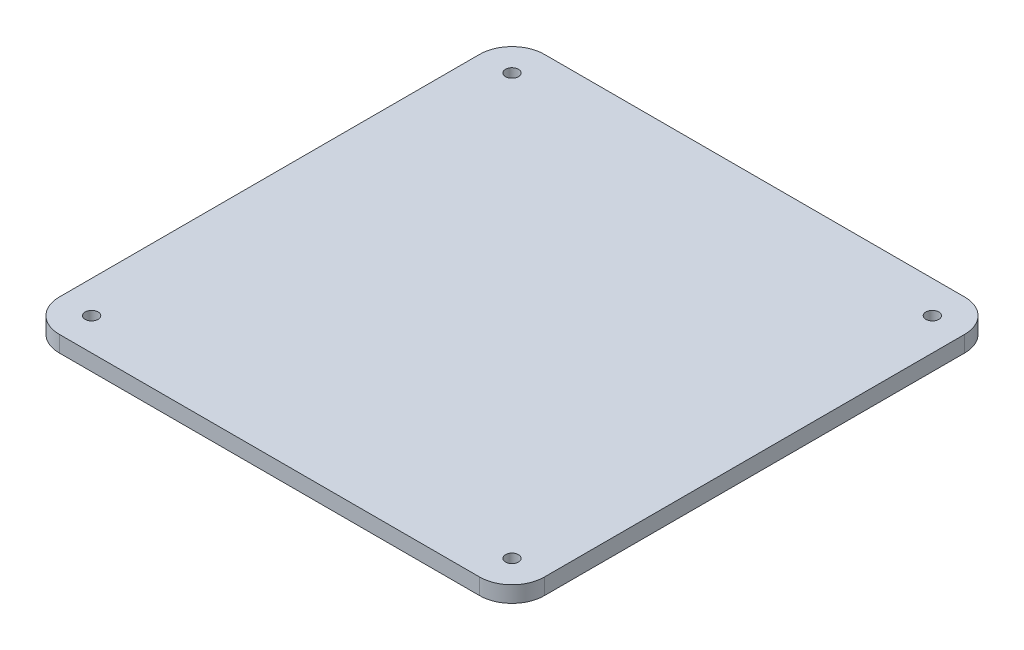
ISO-10303-21;
HEADER;
FILE_DESCRIPTION(('STEP AP214'),'2;1');
FILE_NAME('part.step','',(''),(''),'','','');
FILE_SCHEMA(('AUTOMOTIVE_DESIGN { 1 0 10303 214 1 1 1 1 }'));
ENDSEC;
DATA;
#1=APPLICATION_CONTEXT('core data for automotive mechanical design processes');
#2=APPLICATION_PROTOCOL_DEFINITION('international standard','automotive_design',2000,#1);
#3=PRODUCT_CONTEXT('',#1,'mechanical');
#4=PRODUCT('Part','Part','',(#3));
#5=PRODUCT_RELATED_PRODUCT_CATEGORY('part','',(#4));
#6=PRODUCT_DEFINITION_FORMATION('','',#4);
#7=PRODUCT_DEFINITION_CONTEXT('part definition',#1,'design');
#8=PRODUCT_DEFINITION('design','',#6,#7);
#9=PRODUCT_DEFINITION_SHAPE('','',#8);
#10=(LENGTH_UNIT() NAMED_UNIT(*) SI_UNIT(.MILLI.,.METRE.));
#11=(NAMED_UNIT(*) PLANE_ANGLE_UNIT() SI_UNIT($,.RADIAN.));
#12=(NAMED_UNIT(*) SI_UNIT($,.STERADIAN.) SOLID_ANGLE_UNIT());
#13=UNCERTAINTY_MEASURE_WITH_UNIT(LENGTH_MEASURE(1.E-05),#10,'distance_accuracy_value','');
#14=(GEOMETRIC_REPRESENTATION_CONTEXT(3) GLOBAL_UNCERTAINTY_ASSIGNED_CONTEXT((#13)) GLOBAL_UNIT_ASSIGNED_CONTEXT((#10,
#11,#12)) REPRESENTATION_CONTEXT('',''));
#15=CARTESIAN_POINT('',(0.,0.,0.));
#16=DIRECTION('',(0.,0.,1.));
#17=DIRECTION('',(1.,0.,0.));
#18=AXIS2_PLACEMENT_3D('',#15,#16,#17);
#19=CARTESIAN_POINT('',(-75.,5.,-75.));
#20=DIRECTION('',(0.,0.,-1.));
#21=DIRECTION('',(-1.,0.,0.));
#22=AXIS2_PLACEMENT_3D('',#19,#20,#21);
#23=PLANE('',#22);
#24=DIRECTION('',(1.,0.,0.));
#25=VECTOR('',#24,1.);
#26=CARTESIAN_POINT('',(-75.,0.,-75.));
#27=LINE('',#26,#25);
#28=CARTESIAN_POINT('',(-65.,0.,-75.));
#29=VERTEX_POINT('',#28);
#30=CARTESIAN_POINT('',(65.,0.,-75.));
#31=VERTEX_POINT('',#30);
#32=EDGE_CURVE('E190',#29,#31,#27,.T.);
#33=ORIENTED_EDGE('',*,*,#32,.F.);
#34=DIRECTION('',(0.,-1.,0.));
#35=VECTOR('',#34,1.);
#36=CARTESIAN_POINT('',(-65.,5.,-75.));
#37=LINE('',#36,#35);
#38=CARTESIAN_POINT('',(-65.,5.,-75.));
#39=VERTEX_POINT('',#38);
#40=EDGE_CURVE('E160',#29,#39,#37,.F.);
#41=ORIENTED_EDGE('',*,*,#40,.T.);
#42=DIRECTION('',(1.,0.,0.));
#43=VECTOR('',#42,1.);
#44=CARTESIAN_POINT('',(-75.,5.,-75.));
#45=LINE('',#44,#43);
#46=CARTESIAN_POINT('',(65.,5.,-75.));
#47=VERTEX_POINT('',#46);
#48=EDGE_CURVE('E134',#39,#47,#45,.T.);
#49=ORIENTED_EDGE('',*,*,#48,.T.);
#50=DIRECTION('',(0.,-1.,0.));
#51=VECTOR('',#50,1.);
#52=CARTESIAN_POINT('',(65.,0.,-75.));
#53=LINE('',#52,#51);
#54=EDGE_CURVE('E156',#47,#31,#53,.T.);
#55=ORIENTED_EDGE('',*,*,#54,.T.);
#56=EDGE_LOOP('',(#33,#41,#49,#55));
#57=FACE_BOUND('',#56,.T.);
#58=ADVANCED_FACE('F45',(#57),#23,.T.);
#59=CARTESIAN_POINT('',(-75.,5.,75.));
#60=DIRECTION('',(-1.,0.,0.));
#61=DIRECTION('',(0.,0.,1.));
#62=AXIS2_PLACEMENT_3D('',#59,#60,#61);
#63=PLANE('',#62);
#64=DIRECTION('',(0.,0.,-1.));
#65=VECTOR('',#64,1.);
#66=CARTESIAN_POINT('',(-75.,5.,75.));
#67=LINE('',#66,#65);
#68=CARTESIAN_POINT('',(-75.,5.,65.));
#69=VERTEX_POINT('',#68);
#70=CARTESIAN_POINT('',(-75.,5.,-65.));
#71=VERTEX_POINT('',#70);
#72=EDGE_CURVE('E139',#69,#71,#67,.T.);
#73=ORIENTED_EDGE('',*,*,#72,.T.);
#74=DIRECTION('',(0.,-1.,0.));
#75=VECTOR('',#74,1.);
#76=CARTESIAN_POINT('',(-75.,5.,-65.));
#77=LINE('',#76,#75);
#78=CARTESIAN_POINT('',(-75.,0.,-65.));
#79=VERTEX_POINT('',#78);
#80=EDGE_CURVE('E124',#71,#79,#77,.T.);
#81=ORIENTED_EDGE('',*,*,#80,.T.);
#82=DIRECTION('',(0.,0.,-1.));
#83=VECTOR('',#82,1.);
#84=CARTESIAN_POINT('',(-75.,0.,75.));
#85=LINE('',#84,#83);
#86=CARTESIAN_POINT('',(-75.,0.,65.));
#87=VERTEX_POINT('',#86);
#88=EDGE_CURVE('E115',#87,#79,#85,.T.);
#89=ORIENTED_EDGE('',*,*,#88,.F.);
#90=DIRECTION('',(0.,-1.,0.));
#91=VECTOR('',#90,1.);
#92=CARTESIAN_POINT('',(-75.,5.,65.));
#93=LINE('',#92,#91);
#94=EDGE_CURVE('E130',#87,#69,#93,.F.);
#95=ORIENTED_EDGE('',*,*,#94,.T.);
#96=EDGE_LOOP('',(#73,#81,#89,#95));
#97=FACE_BOUND('',#96,.T.);
#98=ADVANCED_FACE('F129',(#97),#63,.T.);
#99=CARTESIAN_POINT('',(-75.,5.,75.));
#100=DIRECTION('',(0.,0.,-1.));
#101=DIRECTION('',(-1.,0.,0.));
#102=AXIS2_PLACEMENT_3D('',#99,#100,#101);
#103=PLANE('',#102);
#104=DIRECTION('',(1.,0.,0.));
#105=VECTOR('',#104,1.);
#106=CARTESIAN_POINT('',(-75.,0.,75.));
#107=LINE('',#106,#105);
#108=CARTESIAN_POINT('',(-65.,0.,75.));
#109=VERTEX_POINT('',#108);
#110=CARTESIAN_POINT('',(65.,0.,75.));
#111=VERTEX_POINT('',#110);
#112=EDGE_CURVE('E117',#109,#111,#107,.T.);
#113=ORIENTED_EDGE('',*,*,#112,.T.);
#114=DIRECTION('',(0.,-1.,0.));
#115=VECTOR('',#114,1.);
#116=CARTESIAN_POINT('',(65.,5.,75.));
#117=LINE('',#116,#115);
#118=CARTESIAN_POINT('',(65.,5.,75.));
#119=VERTEX_POINT('',#118);
#120=EDGE_CURVE('E11',#111,#119,#117,.F.);
#121=ORIENTED_EDGE('',*,*,#120,.T.);
#122=DIRECTION('',(1.,0.,0.));
#123=VECTOR('',#122,1.);
#124=CARTESIAN_POINT('',(-75.,5.,75.));
#125=LINE('',#124,#123);
#126=CARTESIAN_POINT('',(-65.,5.,75.));
#127=VERTEX_POINT('',#126);
#128=EDGE_CURVE('E144',#127,#119,#125,.T.);
#129=ORIENTED_EDGE('',*,*,#128,.F.);
#130=DIRECTION('',(0.,-1.,0.));
#131=VECTOR('',#130,1.);
#132=CARTESIAN_POINT('',(-65.,0.,75.));
#133=LINE('',#132,#131);
#134=EDGE_CURVE('E54',#127,#109,#133,.T.);
#135=ORIENTED_EDGE('',*,*,#134,.T.);
#136=EDGE_LOOP('',(#113,#121,#129,#135));
#137=FACE_BOUND('',#136,.T.);
#138=ADVANCED_FACE('F181',(#137),#103,.F.);
#139=CARTESIAN_POINT('',(75.,5.,75.));
#140=DIRECTION('',(-1.,0.,0.));
#141=DIRECTION('',(0.,0.,1.));
#142=AXIS2_PLACEMENT_3D('',#139,#140,#141);
#143=PLANE('',#142);
#144=DIRECTION('',(0.,0.,-1.));
#145=VECTOR('',#144,1.);
#146=CARTESIAN_POINT('',(75.,0.,75.));
#147=LINE('',#146,#145);
#148=CARTESIAN_POINT('',(75.,0.,65.));
#149=VERTEX_POINT('',#148);
#150=CARTESIAN_POINT('',(75.,0.,-65.));
#151=VERTEX_POINT('',#150);
#152=EDGE_CURVE('E194',#149,#151,#147,.T.);
#153=ORIENTED_EDGE('',*,*,#152,.T.);
#154=DIRECTION('',(0.,-1.,0.));
#155=VECTOR('',#154,1.);
#156=CARTESIAN_POINT('',(75.,5.,-65.));
#157=LINE('',#156,#155);
#158=CARTESIAN_POINT('',(75.,5.,-65.));
#159=VERTEX_POINT('',#158);
#160=EDGE_CURVE('E61',#151,#159,#157,.F.);
#161=ORIENTED_EDGE('',*,*,#160,.T.);
#162=DIRECTION('',(0.,0.,-1.));
#163=VECTOR('',#162,1.);
#164=CARTESIAN_POINT('',(75.,5.,75.));
#165=LINE('',#164,#163);
#166=CARTESIAN_POINT('',(75.,5.,65.));
#167=VERTEX_POINT('',#166);
#168=EDGE_CURVE('E184',#167,#159,#165,.T.);
#169=ORIENTED_EDGE('',*,*,#168,.F.);
#170=DIRECTION('',(0.,-1.,0.));
#171=VECTOR('',#170,1.);
#172=CARTESIAN_POINT('',(75.,5.,65.));
#173=LINE('',#172,#171);
#174=EDGE_CURVE('E173',#167,#149,#173,.T.);
#175=ORIENTED_EDGE('',*,*,#174,.T.);
#176=EDGE_LOOP('',(#153,#161,#169,#175));
#177=FACE_BOUND('',#176,.T.);
#178=ADVANCED_FACE('F243',(#177),#143,.F.);
#179=CARTESIAN_POINT('',(0.,5.,0.));
#180=DIRECTION('',(0.,1.,0.));
#181=DIRECTION('',(0.,0.,1.));
#182=AXIS2_PLACEMENT_3D('',#179,#180,#181);
#183=PLANE('',#182);
#184=CARTESIAN_POINT('',(65.,5.,65.));
#185=DIRECTION('',(0.,1.,0.));
#186=DIRECTION('',(0.,0.,1.));
#187=AXIS2_PLACEMENT_3D('',#184,#185,#186);
#188=CIRCLE('',#187,2.);
#189=CARTESIAN_POINT('',(65.,5.,67.));
#190=VERTEX_POINT('',#189);
#191=EDGE_CURVE('E222',#190,#190,#188,.T.);
#192=ORIENTED_EDGE('',*,*,#191,.F.);
#193=EDGE_LOOP('',(#192));
#194=FACE_BOUND('',#193,.T.);
#195=CARTESIAN_POINT('',(-65.,5.,65.));
#196=DIRECTION('',(0.,1.,0.));
#197=DIRECTION('',(0.,0.,1.));
#198=AXIS2_PLACEMENT_3D('',#195,#196,#197);
#199=CIRCLE('',#198,2.);
#200=CARTESIAN_POINT('',(-65.,5.,67.));
#201=VERTEX_POINT('',#200);
#202=EDGE_CURVE('E214',#201,#201,#199,.T.);
#203=ORIENTED_EDGE('',*,*,#202,.F.);
#204=EDGE_LOOP('',(#203));
#205=FACE_BOUND('',#204,.T.);
#206=CARTESIAN_POINT('',(-65.,5.,-65.));
#207=DIRECTION('',(0.,1.,0.));
#208=DIRECTION('',(0.,0.,1.));
#209=AXIS2_PLACEMENT_3D('',#206,#207,#208);
#210=CIRCLE('',#209,2.);
#211=CARTESIAN_POINT('',(-65.,5.,-63.));
#212=VERTEX_POINT('',#211);
#213=EDGE_CURVE('E206',#212,#212,#210,.T.);
#214=ORIENTED_EDGE('',*,*,#213,.F.);
#215=EDGE_LOOP('',(#214));
#216=FACE_BOUND('',#215,.T.);
#217=CARTESIAN_POINT('',(65.,5.,-65.));
#218=DIRECTION('',(0.,1.,0.));
#219=DIRECTION('',(0.,0.,1.));
#220=AXIS2_PLACEMENT_3D('',#217,#218,#219);
#221=CIRCLE('',#220,2.);
#222=CARTESIAN_POINT('',(65.,5.,-63.));
#223=VERTEX_POINT('',#222);
#224=EDGE_CURVE('E202',#223,#223,#221,.T.);
#225=ORIENTED_EDGE('',*,*,#224,.F.);
#226=EDGE_LOOP('',(#225));
#227=FACE_BOUND('',#226,.T.);
#228=ORIENTED_EDGE('',*,*,#48,.F.);
#229=CARTESIAN_POINT('',(-65.,5.,-65.));
#230=DIRECTION('',(0.,1.,0.));
#231=DIRECTION('',(0.,0.,1.));
#232=AXIS2_PLACEMENT_3D('',#229,#230,#231);
#233=CIRCLE('',#232,10.);
#234=EDGE_CURVE('E170',#39,#71,#233,.T.);
#235=ORIENTED_EDGE('',*,*,#234,.T.);
#236=ORIENTED_EDGE('',*,*,#72,.F.);
#237=CARTESIAN_POINT('',(-65.,5.,65.));
#238=DIRECTION('',(0.,1.,0.));
#239=DIRECTION('',(0.,0.,1.));
#240=AXIS2_PLACEMENT_3D('',#237,#238,#239);
#241=CIRCLE('',#240,10.);
#242=EDGE_CURVE('E137',#69,#127,#241,.T.);
#243=ORIENTED_EDGE('',*,*,#242,.T.);
#244=ORIENTED_EDGE('',*,*,#128,.T.);
#245=CARTESIAN_POINT('',(65.,5.,65.));
#246=DIRECTION('',(0.,1.,0.));
#247=DIRECTION('',(0.,0.,1.));
#248=AXIS2_PLACEMENT_3D('',#245,#246,#247);
#249=CIRCLE('',#248,10.);
#250=EDGE_CURVE('E68',#119,#167,#249,.T.);
#251=ORIENTED_EDGE('',*,*,#250,.T.);
#252=ORIENTED_EDGE('',*,*,#168,.T.);
#253=CARTESIAN_POINT('',(65.,5.,-65.));
#254=DIRECTION('',(0.,1.,0.));
#255=DIRECTION('',(0.,0.,1.));
#256=AXIS2_PLACEMENT_3D('',#253,#254,#255);
#257=CIRCLE('',#256,10.);
#258=EDGE_CURVE('E167',#159,#47,#257,.T.);
#259=ORIENTED_EDGE('',*,*,#258,.T.);
#260=EDGE_LOOP('',(#228,#235,#236,#243,#244,#251,#252,#259));
#261=FACE_BOUND('',#260,.T.);
#262=ADVANCED_FACE('F270',(#194,#205,#216,#227,#261),#183,.T.);
#263=CARTESIAN_POINT('',(0.,0.,0.));
#264=DIRECTION('',(0.,1.,0.));
#265=DIRECTION('',(0.,0.,1.));
#266=AXIS2_PLACEMENT_3D('',#263,#264,#265);
#267=PLANE('',#266);
#268=CARTESIAN_POINT('',(65.,0.,65.));
#269=DIRECTION('',(0.,1.,0.));
#270=DIRECTION('',(0.,0.,1.));
#271=AXIS2_PLACEMENT_3D('',#268,#269,#270);
#272=CIRCLE('',#271,2.);
#273=CARTESIAN_POINT('',(65.,0.,67.));
#274=VERTEX_POINT('',#273);
#275=EDGE_CURVE('E226',#274,#274,#272,.T.);
#276=ORIENTED_EDGE('',*,*,#275,.T.);
#277=EDGE_LOOP('',(#276));
#278=FACE_BOUND('',#277,.T.);
#279=CARTESIAN_POINT('',(-65.,0.,65.));
#280=DIRECTION('',(0.,1.,0.));
#281=DIRECTION('',(0.,0.,1.));
#282=AXIS2_PLACEMENT_3D('',#279,#280,#281);
#283=CIRCLE('',#282,2.);
#284=CARTESIAN_POINT('',(-65.,0.,67.));
#285=VERTEX_POINT('',#284);
#286=EDGE_CURVE('E218',#285,#285,#283,.T.);
#287=ORIENTED_EDGE('',*,*,#286,.T.);
#288=EDGE_LOOP('',(#287));
#289=FACE_BOUND('',#288,.T.);
#290=CARTESIAN_POINT('',(-65.,0.,-65.));
#291=DIRECTION('',(0.,1.,0.));
#292=DIRECTION('',(0.,0.,1.));
#293=AXIS2_PLACEMENT_3D('',#290,#291,#292);
#294=CIRCLE('',#293,2.);
#295=CARTESIAN_POINT('',(-65.,0.,-63.));
#296=VERTEX_POINT('',#295);
#297=EDGE_CURVE('E210',#296,#296,#294,.T.);
#298=ORIENTED_EDGE('',*,*,#297,.T.);
#299=EDGE_LOOP('',(#298));
#300=FACE_BOUND('',#299,.T.);
#301=CARTESIAN_POINT('',(65.,0.,-65.));
#302=DIRECTION('',(0.,1.,0.));
#303=DIRECTION('',(0.,0.,1.));
#304=AXIS2_PLACEMENT_3D('',#301,#302,#303);
#305=CIRCLE('',#304,2.);
#306=CARTESIAN_POINT('',(65.,0.,-63.));
#307=VERTEX_POINT('',#306);
#308=EDGE_CURVE('E195',#307,#307,#305,.T.);
#309=ORIENTED_EDGE('',*,*,#308,.T.);
#310=EDGE_LOOP('',(#309));
#311=FACE_BOUND('',#310,.T.);
#312=ORIENTED_EDGE('',*,*,#88,.T.);
#313=CARTESIAN_POINT('',(-65.,0.,-65.));
#314=DIRECTION('',(0.,1.,0.));
#315=DIRECTION('',(0.,0.,1.));
#316=AXIS2_PLACEMENT_3D('',#313,#314,#315);
#317=CIRCLE('',#316,10.);
#318=EDGE_CURVE('E153',#79,#29,#317,.F.);
#319=ORIENTED_EDGE('',*,*,#318,.T.);
#320=ORIENTED_EDGE('',*,*,#32,.T.);
#321=CARTESIAN_POINT('',(65.,0.,-65.));
#322=DIRECTION('',(0.,1.,0.));
#323=DIRECTION('',(0.,0.,1.));
#324=AXIS2_PLACEMENT_3D('',#321,#322,#323);
#325=CIRCLE('',#324,10.);
#326=EDGE_CURVE('E150',#31,#151,#325,.F.);
#327=ORIENTED_EDGE('',*,*,#326,.T.);
#328=ORIENTED_EDGE('',*,*,#152,.F.);
#329=CARTESIAN_POINT('',(65.,0.,65.));
#330=DIRECTION('',(0.,1.,0.));
#331=DIRECTION('',(0.,0.,1.));
#332=AXIS2_PLACEMENT_3D('',#329,#330,#331);
#333=CIRCLE('',#332,10.);
#334=EDGE_CURVE('E123',#149,#111,#333,.F.);
#335=ORIENTED_EDGE('',*,*,#334,.T.);
#336=ORIENTED_EDGE('',*,*,#112,.F.);
#337=CARTESIAN_POINT('',(-65.,0.,65.));
#338=DIRECTION('',(0.,1.,0.));
#339=DIRECTION('',(0.,0.,1.));
#340=AXIS2_PLACEMENT_3D('',#337,#338,#339);
#341=CIRCLE('',#340,10.);
#342=EDGE_CURVE('E112',#109,#87,#341,.F.);
#343=ORIENTED_EDGE('',*,*,#342,.T.);
#344=EDGE_LOOP('',(#312,#319,#320,#327,#328,#335,#336,#343));
#345=FACE_BOUND('',#344,.T.);
#346=ADVANCED_FACE('F114',(#278,#289,#300,#311,#345),#267,.F.);
#347=CARTESIAN_POINT('',(-65.,5.,-65.));
#348=DIRECTION('',(0.,-1.,0.));
#349=DIRECTION('',(0.,0.,-1.));
#350=AXIS2_PLACEMENT_3D('',#347,#348,#349);
#351=CYLINDRICAL_SURFACE('',#350,10.);
#352=ORIENTED_EDGE('',*,*,#234,.F.);
#353=ORIENTED_EDGE('',*,*,#40,.F.);
#354=ORIENTED_EDGE('',*,*,#318,.F.);
#355=ORIENTED_EDGE('',*,*,#80,.F.);
#356=EDGE_LOOP('',(#352,#353,#354,#355));
#357=FACE_BOUND('',#356,.T.);
#358=ADVANCED_FACE('F253',(#357),#351,.T.);
#359=CARTESIAN_POINT('',(65.,5.,-65.));
#360=DIRECTION('',(0.,1.,0.));
#361=DIRECTION('',(0.,0.,1.));
#362=AXIS2_PLACEMENT_3D('',#359,#360,#361);
#363=CYLINDRICAL_SURFACE('',#362,10.);
#364=ORIENTED_EDGE('',*,*,#258,.F.);
#365=ORIENTED_EDGE('',*,*,#160,.F.);
#366=ORIENTED_EDGE('',*,*,#326,.F.);
#367=ORIENTED_EDGE('',*,*,#54,.F.);
#368=EDGE_LOOP('',(#364,#365,#366,#367));
#369=FACE_BOUND('',#368,.T.);
#370=ADVANCED_FACE('F241',(#369),#363,.T.);
#371=CARTESIAN_POINT('',(65.,5.,65.));
#372=DIRECTION('',(0.,-1.,0.));
#373=DIRECTION('',(0.,0.,-1.));
#374=AXIS2_PLACEMENT_3D('',#371,#372,#373);
#375=CYLINDRICAL_SURFACE('',#374,10.);
#376=ORIENTED_EDGE('',*,*,#250,.F.);
#377=ORIENTED_EDGE('',*,*,#120,.F.);
#378=ORIENTED_EDGE('',*,*,#334,.F.);
#379=ORIENTED_EDGE('',*,*,#174,.F.);
#380=EDGE_LOOP('',(#376,#377,#378,#379));
#381=FACE_BOUND('',#380,.T.);
#382=ADVANCED_FACE('F246',(#381),#375,.T.);
#383=CARTESIAN_POINT('',(-65.,5.,65.));
#384=DIRECTION('',(0.,1.,0.));
#385=DIRECTION('',(0.,0.,1.));
#386=AXIS2_PLACEMENT_3D('',#383,#384,#385);
#387=CYLINDRICAL_SURFACE('',#386,10.);
#388=ORIENTED_EDGE('',*,*,#242,.F.);
#389=ORIENTED_EDGE('',*,*,#94,.F.);
#390=ORIENTED_EDGE('',*,*,#342,.F.);
#391=ORIENTED_EDGE('',*,*,#134,.F.);
#392=EDGE_LOOP('',(#388,#389,#390,#391));
#393=FACE_BOUND('',#392,.T.);
#394=ADVANCED_FACE('F47',(#393),#387,.T.);
#395=CARTESIAN_POINT('',(65.,0.,-65.));
#396=DIRECTION('',(0.,1.,0.));
#397=DIRECTION('',(0.,0.,1.));
#398=AXIS2_PLACEMENT_3D('',#395,#396,#397);
#399=CYLINDRICAL_SURFACE('',#398,2.);
#400=ORIENTED_EDGE('',*,*,#308,.F.);
#401=EDGE_LOOP('',(#400));
#402=FACE_BOUND('',#401,.T.);
#403=ORIENTED_EDGE('',*,*,#224,.T.);
#404=EDGE_LOOP('',(#403));
#405=FACE_BOUND('',#404,.T.);
#406=ADVANCED_FACE('F252',(#402,#405),#399,.F.);
#407=CARTESIAN_POINT('',(-65.,0.,-65.));
#408=DIRECTION('',(0.,1.,0.));
#409=DIRECTION('',(0.,0.,1.));
#410=AXIS2_PLACEMENT_3D('',#407,#408,#409);
#411=CYLINDRICAL_SURFACE('',#410,2.);
#412=ORIENTED_EDGE('',*,*,#297,.F.);
#413=EDGE_LOOP('',(#412));
#414=FACE_BOUND('',#413,.T.);
#415=ORIENTED_EDGE('',*,*,#213,.T.);
#416=EDGE_LOOP('',(#415));
#417=FACE_BOUND('',#416,.T.);
#418=ADVANCED_FACE('F331',(#414,#417),#411,.F.);
#419=CARTESIAN_POINT('',(-65.,0.,65.));
#420=DIRECTION('',(0.,1.,0.));
#421=DIRECTION('',(0.,0.,1.));
#422=AXIS2_PLACEMENT_3D('',#419,#420,#421);
#423=CYLINDRICAL_SURFACE('',#422,2.);
#424=ORIENTED_EDGE('',*,*,#286,.F.);
#425=EDGE_LOOP('',(#424));
#426=FACE_BOUND('',#425,.T.);
#427=ORIENTED_EDGE('',*,*,#202,.T.);
#428=EDGE_LOOP('',(#427));
#429=FACE_BOUND('',#428,.T.);
#430=ADVANCED_FACE('F340',(#426,#429),#423,.F.);
#431=CARTESIAN_POINT('',(65.,0.,65.));
#432=DIRECTION('',(0.,1.,0.));
#433=DIRECTION('',(0.,0.,1.));
#434=AXIS2_PLACEMENT_3D('',#431,#432,#433);
#435=CYLINDRICAL_SURFACE('',#434,2.);
#436=ORIENTED_EDGE('',*,*,#275,.F.);
#437=EDGE_LOOP('',(#436));
#438=FACE_BOUND('',#437,.T.);
#439=ORIENTED_EDGE('',*,*,#191,.T.);
#440=EDGE_LOOP('',(#439));
#441=FACE_BOUND('',#440,.T.);
#442=ADVANCED_FACE('F350',(#438,#441),#435,.F.);
#443=CLOSED_SHELL('',(#58,#98,#138,#178,#262,#346,#358,#370,#382,#394,#406,#418,#430,#442));
#444=MANIFOLD_SOLID_BREP('B2',#443);
#445=ADVANCED_BREP_SHAPE_REPRESENTATION('',(#18,#444),#14);
#446=SHAPE_DEFINITION_REPRESENTATION(#9,#445);
ENDSEC;
END-ISO-10303-21;
